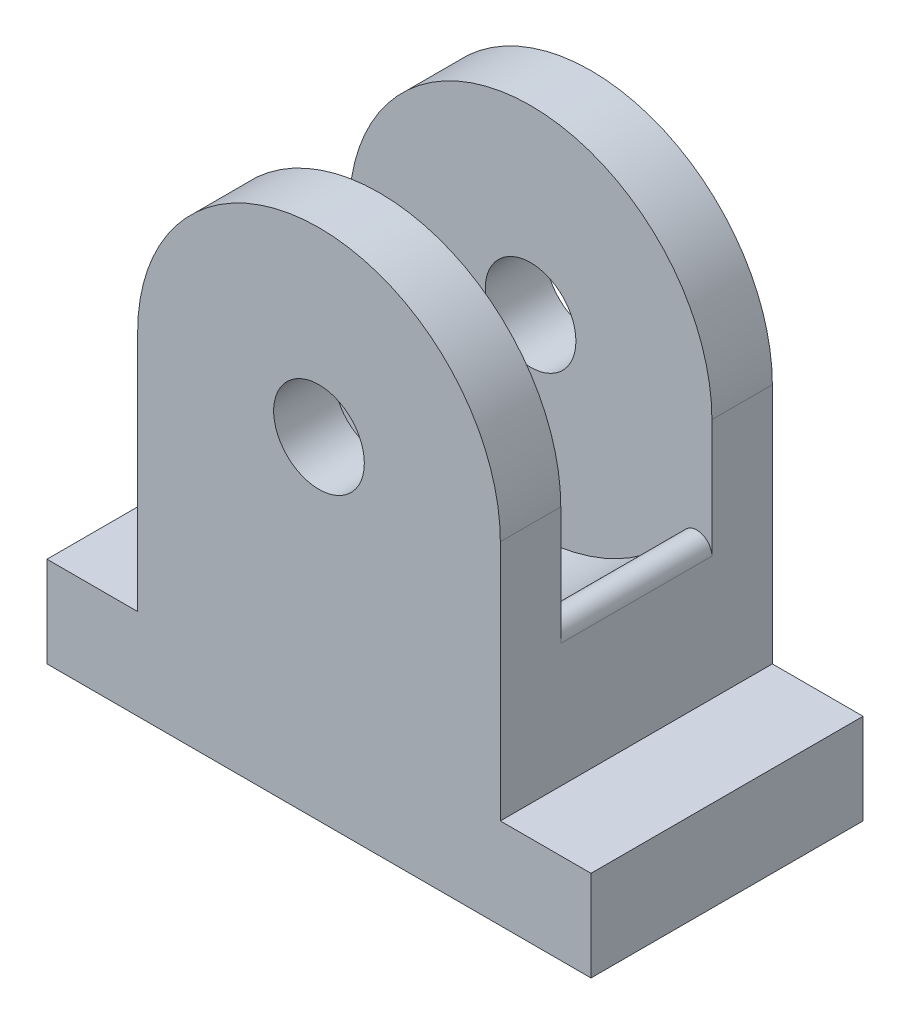
ISO-10303-21;
HEADER;
FILE_DESCRIPTION(('STEP AP214'),'2;1');
FILE_NAME('part.step','',(''),(''),'','','');
FILE_SCHEMA(('AUTOMOTIVE_DESIGN { 1 0 10303 214 1 1 1 1 }'));
ENDSEC;
DATA;
#1=APPLICATION_CONTEXT('core data for automotive mechanical design processes');
#2=APPLICATION_PROTOCOL_DEFINITION('international standard','automotive_design',2000,#1);
#3=PRODUCT_CONTEXT('',#1,'mechanical');
#4=PRODUCT('Part','Part','',(#3));
#5=PRODUCT_RELATED_PRODUCT_CATEGORY('part','',(#4));
#6=PRODUCT_DEFINITION_FORMATION('','',#4);
#7=PRODUCT_DEFINITION_CONTEXT('part definition',#1,'design');
#8=PRODUCT_DEFINITION('design','',#6,#7);
#9=PRODUCT_DEFINITION_SHAPE('','',#8);
#10=(LENGTH_UNIT() NAMED_UNIT(*) SI_UNIT(.MILLI.,.METRE.));
#11=(NAMED_UNIT(*) PLANE_ANGLE_UNIT() SI_UNIT($,.RADIAN.));
#12=(NAMED_UNIT(*) SI_UNIT($,.STERADIAN.) SOLID_ANGLE_UNIT());
#13=UNCERTAINTY_MEASURE_WITH_UNIT(LENGTH_MEASURE(1.E-05),#10,'distance_accuracy_value','');
#14=(GEOMETRIC_REPRESENTATION_CONTEXT(3) GLOBAL_UNCERTAINTY_ASSIGNED_CONTEXT((#13)) GLOBAL_UNIT_ASSIGNED_CONTEXT((#10,
#11,#12)) REPRESENTATION_CONTEXT('',''));
#15=CARTESIAN_POINT('',(0.,0.,0.));
#16=DIRECTION('',(0.,0.,1.));
#17=DIRECTION('',(1.,0.,0.));
#18=AXIS2_PLACEMENT_3D('',#15,#16,#17);
#19=CARTESIAN_POINT('',(0.,0.,4.5));
#20=DIRECTION('',(0.,0.,-1.));
#21=DIRECTION('',(-1.,0.,0.));
#22=AXIS2_PLACEMENT_3D('',#19,#20,#21);
#23=CYLINDRICAL_SURFACE('',#22,6.25);
#24=DIRECTION('',(0.,0.,-1.));
#25=VECTOR('',#24,1.);
#26=CARTESIAN_POINT('',(-5.09259259259259,-3.62325829687466,4.5));
#27=LINE('',#26,#25);
#28=CARTESIAN_POINT('',(-5.09259259259259,-3.62325829687466,2.));
#29=VERTEX_POINT('',#28);
#30=CARTESIAN_POINT('',(-5.09259259259259,-3.62325829687466,7.));
#31=VERTEX_POINT('',#30);
#32=EDGE_CURVE('E250',#29,#31,#27,.F.);
#33=ORIENTED_EDGE('',*,*,#32,.T.);
#34=CARTESIAN_POINT('',(0.,0.,7.));
#35=DIRECTION('',(0.,0.,-1.));
#36=DIRECTION('',(1.,0.,0.));
#37=AXIS2_PLACEMENT_3D('',#34,#35,#36);
#38=CIRCLE('',#37,6.25);
#39=CARTESIAN_POINT('',(5.09259259259259,-3.62325829687466,7.));
#40=VERTEX_POINT('',#39);
#41=EDGE_CURVE('E262',#40,#31,#38,.T.);
#42=ORIENTED_EDGE('',*,*,#41,.F.);
#43=DIRECTION('',(0.,0.,-1.));
#44=VECTOR('',#43,1.);
#45=CARTESIAN_POINT('',(5.09259259259259,-3.62325829687466,4.5));
#46=LINE('',#45,#44);
#47=CARTESIAN_POINT('',(5.09259259259259,-3.62325829687466,2.));
#48=VERTEX_POINT('',#47);
#49=EDGE_CURVE('E255',#40,#48,#46,.T.);
#50=ORIENTED_EDGE('',*,*,#49,.T.);
#51=CARTESIAN_POINT('',(0.,0.,2.));
#52=DIRECTION('',(0.,0.,-1.));
#53=DIRECTION('',(1.,0.,0.));
#54=AXIS2_PLACEMENT_3D('',#51,#52,#53);
#55=CIRCLE('',#54,6.25);
#56=EDGE_CURVE('E193',#48,#29,#55,.T.);
#57=ORIENTED_EDGE('',*,*,#56,.T.);
#58=EDGE_LOOP('',(#33,#42,#50,#57));
#59=FACE_BOUND('',#58,.T.);
#60=CARTESIAN_POINT('',(0.,-6.25,5.85));
#61=CARTESIAN_POINT('',(0.0748978096361095,-6.24999861581629,5.84999741034657));
#62=CARTESIAN_POINT('',(0.149827124191835,-6.24863997464167,5.84374597422724));
#63=CARTESIAN_POINT('',(0.297558976297404,-6.24335128756539,5.81893043998775));
#64=CARTESIAN_POINT('',(0.370359928320541,-6.23941937324927,5.80035739520087));
#65=CARTESIAN_POINT('',(0.511678529268872,-6.22942211904332,5.75150627019417));
#66=CARTESIAN_POINT('',(0.580200512385534,-6.2233589805583,5.72124026479619));
#67=CARTESIAN_POINT('',(0.711191114316262,-6.20975437315621,5.64990031863387));
#68=CARTESIAN_POINT('',(0.773659920097922,-6.20221294992144,5.60882671183515));
#69=CARTESIAN_POINT('',(0.891752597800647,-6.18634636801673,5.51635615783804));
#70=CARTESIAN_POINT('',(0.947268019970313,-6.17801169008855,5.46482233232173));
#71=CARTESIAN_POINT('',(1.04893788922345,-6.16156536796766,5.35318810995162));
#72=CARTESIAN_POINT('',(1.09509151799101,-6.15345374332559,5.29308696500821));
#73=CARTESIAN_POINT('',(1.17720361317461,-6.13827824078049,5.16522557734729));
#74=CARTESIAN_POINT('',(1.21304710226318,-6.13122656854735,5.09738991875832));
#75=CARTESIAN_POINT('',(1.27278407294276,-6.1191058096365,4.95648074161041));
#76=CARTESIAN_POINT('',(1.29667894540872,-6.1140364922184,4.88340783382453));
#77=CARTESIAN_POINT('',(1.33148293213386,-6.10655126462745,4.73527342952429));
#78=CARTESIAN_POINT('',(1.34258380128755,-6.10409621588904,4.66025900525517));
#79=CARTESIAN_POINT('',(1.35208081177302,-6.1019999104426,4.5093954183492));
#80=CARTESIAN_POINT('',(1.35047847470499,-6.10235831673662,4.4335463567727));
#81=CARTESIAN_POINT('',(1.33476897932179,-6.1058129733535,4.28458868169098));
#82=CARTESIAN_POINT('',(1.32088413245389,-6.10886054773759,4.21145532302482));
#83=CARTESIAN_POINT('',(1.28135577014403,-6.11727324424412,4.06858114357149));
#84=CARTESIAN_POINT('',(1.25571160968183,-6.12263849349441,3.99884050911371));
#85=CARTESIAN_POINT('',(1.1931872120857,-6.13513024879315,3.86410412628));
#86=CARTESIAN_POINT('',(1.15622109723758,-6.14227013471899,3.79914952152846));
#87=CARTESIAN_POINT('',(1.07216253831035,-6.157498414892,3.67628287641741));
#88=CARTESIAN_POINT('',(1.02506874631776,-6.16558693532969,3.61837177510006));
#89=CARTESIAN_POINT('',(0.920912816838289,-6.18201026812592,3.50995566349795));
#90=CARTESIAN_POINT('',(0.863661532942302,-6.19034667875595,3.45963243407206));
#91=CARTESIAN_POINT('',(0.741438443532449,-6.20617114145333,3.36927243546437));
#92=CARTESIAN_POINT('',(0.676466504836565,-6.21365917888181,3.3292358437657));
#93=CARTESIAN_POINT('',(0.540427554958071,-6.22696656271637,3.26054240984356));
#94=CARTESIAN_POINT('',(0.469348390747127,-6.23278247690027,3.23190892807234));
#95=CARTESIAN_POINT('',(0.323234121488422,-6.24206473515479,3.18704226149253));
#96=CARTESIAN_POINT('',(0.248199578746133,-6.24553141223256,3.17080731913489));
#97=CARTESIAN_POINT('',(0.097864197091749,-6.24967735063362,3.15146191694495));
#98=CARTESIAN_POINT('',(0.0225967331389312,-6.25040935706062,3.14810307499253));
#99=CARTESIAN_POINT('',(-0.127423818972377,-6.24915108649817,3.15393264018703));
#100=CARTESIAN_POINT('',(-0.202176940782123,-6.24716098933985,3.16312021847603));
#101=CARTESIAN_POINT('',(-0.348227141284269,-6.24071536589487,3.19357579630874));
#102=CARTESIAN_POINT('',(-0.419552571259704,-6.23628635326114,3.21471394499583));
#103=CARTESIAN_POINT('',(-0.557645616500002,-6.22545845649614,3.26832683760487));
#104=CARTESIAN_POINT('',(-0.624412849596855,-6.21905940744043,3.30080253069627));
#105=CARTESIAN_POINT('',(-0.752524380823113,-6.20487092055961,3.37668914064983));
#106=CARTESIAN_POINT('',(-0.813779863979238,-6.19706330348932,3.42024652067401));
#107=CARTESIAN_POINT('',(-0.928201254236524,-6.18096165151345,3.51686671943826));
#108=CARTESIAN_POINT('',(-0.981366136966816,-6.17266755519741,3.56993073998876));
#109=CARTESIAN_POINT('',(-1.0790756709002,-6.15634621464983,3.68519639249067));
#110=CARTESIAN_POINT('',(-1.12344854237619,-6.14832642832587,3.74754488998852));
#111=CARTESIAN_POINT('',(-1.20109400598567,-6.13363196375991,3.87895522252143));
#112=CARTESIAN_POINT('',(-1.23436707416059,-6.12695722783711,3.94801676948733));
#113=CARTESIAN_POINT('',(-1.28864661790835,-6.1157713027968,4.09052490794086));
#114=CARTESIAN_POINT('',(-1.30972139525587,-6.11124809258382,4.16394449424816));
#115=CARTESIAN_POINT('',(-1.33920738747857,-6.10485506361185,4.31339279939407));
#116=CARTESIAN_POINT('',(-1.34762056982402,-6.10298483261214,4.38942111098764));
#117=CARTESIAN_POINT('',(-1.35146243914018,-6.10213503405996,4.54019784514477));
#118=CARTESIAN_POINT('',(-1.34716334207217,-6.10309486339383,4.61493911920589));
#119=CARTESIAN_POINT('',(-1.32631007639841,-6.10766022776293,4.76260542219088));
#120=CARTESIAN_POINT('',(-1.30975604485933,-6.11126573320731,4.83553047141908));
#121=CARTESIAN_POINT('',(-1.26499285043262,-6.12068702031061,4.97728450065752));
#122=CARTESIAN_POINT('',(-1.23682236697838,-6.1264954617247,5.04612621497996));
#123=CARTESIAN_POINT('',(-1.16965950719278,-6.13967121716878,5.1781470345763));
#124=CARTESIAN_POINT('',(-1.13066603576335,-6.14703868892758,5.24132556597838));
#125=CARTESIAN_POINT('',(-1.04205714295264,-6.16268407562946,5.3615705981713));
#126=CARTESIAN_POINT('',(-0.992247325560747,-6.17097708593509,5.41849191108093));
#127=CARTESIAN_POINT('',(-0.883814758618736,-6.1874366898516,5.52325757239144));
#128=CARTESIAN_POINT('',(-0.825189977129407,-6.19560325383533,5.57109982220879));
#129=CARTESIAN_POINT('',(-0.699902983155826,-6.21101159381186,5.656924499032));
#130=CARTESIAN_POINT('',(-0.633148919741541,-6.21824044049574,5.69477528812321));
#131=CARTESIAN_POINT('',(-0.4940850138529,-6.2308295525729,5.75865978799255));
#132=CARTESIAN_POINT('',(-0.421779944901871,-6.23619140198087,5.78470352191314));
#133=CARTESIAN_POINT('',(-0.291157087569732,-6.24347278744987,5.81953195295137));
#134=CARTESIAN_POINT('',(-0.233551854911721,-6.24590545876608,5.8309358899752));
#135=CARTESIAN_POINT('',(-0.117304160996096,-6.24916957326932,5.84617076761794));
#136=CARTESIAN_POINT('',(-0.0586617436783265,-6.25000108412556,5.85000202827809));
#137=CARTESIAN_POINT('',(0.,-6.25,5.85));
#138=B_SPLINE_CURVE_WITH_KNOTS('',3,(#60,#61,#62,#63,#64,#65,#66,#67,#68,#69,#70,#71,#72,#73,
#74,#75,#76,#77,#78,#79,#80,#81,#82,#83,#84,#85,#86,#87,#88,#89,#90,#91,#92,#93,#94,#95,#96,#97,
#98,#99,#100,#101,#102,#103,#104,#105,#106,#107,#108,#109,#110,#111,#112,#113,#114,#115,#116,
#117,#118,#119,#120,#121,#122,#123,#124,#125,#126,#127,#128,#129,#130,#131,#132,#133,#134,#135,
#136,#137),.UNSPECIFIED.,.T.,.F.,(4,2,2,2,2,2,2,2,2,2,2,2,2,2,2,2,2,2,2,2,2,2,2,2,2,2,2,2,2,2,2,
2,2,2,2,2,2,2,4),(0.,0.224478722217928,0.449120616119271,0.673531149315529,0.897934748817567,
1.12548983415913,1.35306480156489,1.5830871295524,1.81308267562639,2.03958431476272,
2.26605882376131,2.48851618608015,2.71098575205936,2.93518640301403,3.15941691178404,
3.38837253084416,3.61733209998361,3.84675833301939,4.07615203780903,4.30109775663303,
4.5260286155195,4.7485611703904,4.97111235996431,5.19677339020995,5.42246296822622,
5.65220188881187,5.88193095523105,6.11036093790415,6.33875542144641,6.56229481267941,
6.78583170374923,7.00863021573458,7.23145127927605,7.45866870150071,7.6859385801831,
7.91606813022947,8.14600195319907,8.32182645181924,8.49764351947402),.UNSPECIFIED.);
#139=CARTESIAN_POINT('',(0.,-6.25,5.85));
#140=VERTEX_POINT('',#139);
#141=EDGE_CURVE('E37',#140,#140,#138,.T.);
#142=ORIENTED_EDGE('',*,*,#141,.F.);
#143=EDGE_LOOP('',(#142));
#144=FACE_BOUND('',#143,.T.);
#145=ADVANCED_FACE('F33',(#59,#144),#23,.F.);
#146=CARTESIAN_POINT('',(0.,0.,2.));
#147=DIRECTION('',(0.,0.,1.));
#148=DIRECTION('',(1.,0.,0.));
#149=AXIS2_PLACEMENT_3D('',#146,#147,#148);
#150=PLANE('',#149);
#151=CARTESIAN_POINT('',(0.,0.,2.));
#152=DIRECTION('',(0.,0.,1.));
#153=DIRECTION('',(1.,0.,0.));
#154=AXIS2_PLACEMENT_3D('',#151,#152,#153);
#155=CIRCLE('',#154,1.5);
#156=CARTESIAN_POINT('',(1.5,0.,2.));
#157=VERTEX_POINT('',#156);
#158=EDGE_CURVE('E196',#157,#157,#155,.T.);
#159=ORIENTED_EDGE('',*,*,#158,.F.);
#160=EDGE_LOOP('',(#159));
#161=FACE_BOUND('',#160,.T.);
#162=DIRECTION('',(0.,-1.,0.));
#163=VECTOR('',#162,1.);
#164=CARTESIAN_POINT('',(-6.,0.,2.));
#165=LINE('',#164,#163);
#166=CARTESIAN_POINT('',(-6.,0.,2.));
#167=VERTEX_POINT('',#166);
#168=CARTESIAN_POINT('',(-6.,-3.91311896062463,2.));
#169=VERTEX_POINT('',#168);
#170=EDGE_CURVE('E206',#167,#169,#165,.T.);
#171=ORIENTED_EDGE('',*,*,#170,.T.);
#172=CARTESIAN_POINT('',(-5.5,-3.91311896062463,2.));
#173=DIRECTION('',(0.,0.,1.));
#174=DIRECTION('',(1.,0.,0.));
#175=AXIS2_PLACEMENT_3D('',#172,#173,#174);
#176=CIRCLE('',#175,0.5);
#177=EDGE_CURVE('E252',#169,#29,#176,.F.);
#178=ORIENTED_EDGE('',*,*,#177,.T.);
#179=ORIENTED_EDGE('',*,*,#56,.F.);
#180=CARTESIAN_POINT('',(5.5,-3.91311896062463,2.));
#181=DIRECTION('',(0.,0.,1.));
#182=DIRECTION('',(1.,0.,0.));
#183=AXIS2_PLACEMENT_3D('',#180,#181,#182);
#184=CIRCLE('',#183,0.5);
#185=CARTESIAN_POINT('',(6.,-3.91311896062463,2.));
#186=VERTEX_POINT('',#185);
#187=EDGE_CURVE('E11',#48,#186,#184,.F.);
#188=ORIENTED_EDGE('',*,*,#187,.T.);
#189=DIRECTION('',(0.,1.,0.));
#190=VECTOR('',#189,1.);
#191=CARTESIAN_POINT('',(6.,0.,2.));
#192=LINE('',#191,#190);
#193=CARTESIAN_POINT('',(6.,0.,2.));
#194=VERTEX_POINT('',#193);
#195=EDGE_CURVE('E54',#186,#194,#192,.T.);
#196=ORIENTED_EDGE('',*,*,#195,.T.);
#197=CARTESIAN_POINT('',(0.,0.,2.));
#198=DIRECTION('',(0.,0.,1.));
#199=DIRECTION('',(1.,0.,0.));
#200=AXIS2_PLACEMENT_3D('',#197,#198,#199);
#201=CIRCLE('',#200,6.);
#202=EDGE_CURVE('E203',#194,#167,#201,.T.);
#203=ORIENTED_EDGE('',*,*,#202,.T.);
#204=EDGE_LOOP('',(#171,#178,#179,#188,#196,#203));
#205=FACE_BOUND('',#204,.T.);
#206=ADVANCED_FACE('F264',(#161,#205),#150,.T.);
#207=CARTESIAN_POINT('',(-6.,-8.,2.));
#208=DIRECTION('',(0.,-1.,0.));
#209=DIRECTION('',(0.,0.,-1.));
#210=AXIS2_PLACEMENT_3D('',#207,#208,#209);
#211=PLANE('',#210);
#212=DIRECTION('',(0.,0.,-1.));
#213=VECTOR('',#212,1.);
#214=CARTESIAN_POINT('',(-9.,-8.,2.));
#215=LINE('',#214,#213);
#216=CARTESIAN_POINT('',(-9.,-8.,9.));
#217=VERTEX_POINT('',#216);
#218=CARTESIAN_POINT('',(-9.,-8.,0.));
#219=VERTEX_POINT('',#218);
#220=EDGE_CURVE('E208',#217,#219,#215,.T.);
#221=ORIENTED_EDGE('',*,*,#220,.F.);
#222=DIRECTION('',(-1.,0.,0.));
#223=VECTOR('',#222,1.);
#224=CARTESIAN_POINT('',(-6.,-8.,9.));
#225=LINE('',#224,#223);
#226=CARTESIAN_POINT('',(-6.,-8.,9.));
#227=VERTEX_POINT('',#226);
#228=EDGE_CURVE('E157',#227,#217,#225,.T.);
#229=ORIENTED_EDGE('',*,*,#228,.F.);
#230=DIRECTION('',(0.,0.,-1.));
#231=VECTOR('',#230,1.);
#232=CARTESIAN_POINT('',(-6.,-8.,2.));
#233=LINE('',#232,#231);
#234=CARTESIAN_POINT('',(-6.,-8.,0.));
#235=VERTEX_POINT('',#234);
#236=EDGE_CURVE('E226',#227,#235,#233,.T.);
#237=ORIENTED_EDGE('',*,*,#236,.T.);
#238=DIRECTION('',(-1.,0.,0.));
#239=VECTOR('',#238,1.);
#240=CARTESIAN_POINT('',(-6.,-8.,0.));
#241=LINE('',#240,#239);
#242=EDGE_CURVE('E204',#235,#219,#241,.T.);
#243=ORIENTED_EDGE('',*,*,#242,.T.);
#244=EDGE_LOOP('',(#221,#229,#237,#243));
#245=FACE_BOUND('',#244,.T.);
#246=ADVANCED_FACE('F302',(#245),#211,.F.);
#247=DIRECTION('',(0.,0.,-1.));
#248=VECTOR('',#247,1.);
#249=CARTESIAN_POINT('',(6.,-8.,2.));
#250=LINE('',#249,#248);
#251=CARTESIAN_POINT('',(6.,-8.,9.));
#252=VERTEX_POINT('',#251);
#253=CARTESIAN_POINT('',(6.,-8.,0.));
#254=VERTEX_POINT('',#253);
#255=EDGE_CURVE('E235',#252,#254,#250,.T.);
#256=ORIENTED_EDGE('',*,*,#255,.F.);
#257=DIRECTION('',(-1.,0.,0.));
#258=VECTOR('',#257,1.);
#259=CARTESIAN_POINT('',(9.,-8.,9.));
#260=LINE('',#259,#258);
#261=CARTESIAN_POINT('',(9.,-8.,9.));
#262=VERTEX_POINT('',#261);
#263=EDGE_CURVE('E177',#262,#252,#260,.T.);
#264=ORIENTED_EDGE('',*,*,#263,.F.);
#265=DIRECTION('',(0.,0.,-1.));
#266=VECTOR('',#265,1.);
#267=CARTESIAN_POINT('',(9.,-8.,2.));
#268=LINE('',#267,#266);
#269=CARTESIAN_POINT('',(9.,-8.,0.));
#270=VERTEX_POINT('',#269);
#271=EDGE_CURVE('E238',#262,#270,#268,.T.);
#272=ORIENTED_EDGE('',*,*,#271,.T.);
#273=DIRECTION('',(-1.,0.,0.));
#274=VECTOR('',#273,1.);
#275=CARTESIAN_POINT('',(9.,-8.,0.));
#276=LINE('',#275,#274);
#277=EDGE_CURVE('E215',#270,#254,#276,.T.);
#278=ORIENTED_EDGE('',*,*,#277,.T.);
#279=EDGE_LOOP('',(#256,#264,#272,#278));
#280=FACE_BOUND('',#279,.T.);
#281=ADVANCED_FACE('F316',(#280),#211,.F.);
#282=CARTESIAN_POINT('',(0.,0.,0.));
#283=DIRECTION('',(0.,0.,1.));
#284=DIRECTION('',(1.,0.,0.));
#285=AXIS2_PLACEMENT_3D('',#282,#283,#284);
#286=PLANE('',#285);
#287=DIRECTION('',(0.,-1.,0.));
#288=VECTOR('',#287,1.);
#289=CARTESIAN_POINT('',(-9.,-8.,0.));
#290=LINE('',#289,#288);
#291=CARTESIAN_POINT('',(-9.,-11.,0.));
#292=VERTEX_POINT('',#291);
#293=EDGE_CURVE('E199',#219,#292,#290,.T.);
#294=ORIENTED_EDGE('',*,*,#293,.F.);
#295=ORIENTED_EDGE('',*,*,#242,.F.);
#296=DIRECTION('',(0.,-1.,0.));
#297=VECTOR('',#296,1.);
#298=CARTESIAN_POINT('',(-6.,0.,0.));
#299=LINE('',#298,#297);
#300=CARTESIAN_POINT('',(-6.,0.,0.));
#301=VERTEX_POINT('',#300);
#302=EDGE_CURVE('E221',#301,#235,#299,.T.);
#303=ORIENTED_EDGE('',*,*,#302,.F.);
#304=CARTESIAN_POINT('',(0.,0.,0.));
#305=DIRECTION('',(0.,0.,1.));
#306=DIRECTION('',(1.,0.,0.));
#307=AXIS2_PLACEMENT_3D('',#304,#305,#306);
#308=CIRCLE('',#307,6.);
#309=CARTESIAN_POINT('',(6.,0.,0.));
#310=VERTEX_POINT('',#309);
#311=EDGE_CURVE('E219',#310,#301,#308,.T.);
#312=ORIENTED_EDGE('',*,*,#311,.F.);
#313=DIRECTION('',(0.,1.,0.));
#314=VECTOR('',#313,1.);
#315=CARTESIAN_POINT('',(6.,0.,0.));
#316=LINE('',#315,#314);
#317=EDGE_CURVE('E217',#254,#310,#316,.T.);
#318=ORIENTED_EDGE('',*,*,#317,.F.);
#319=ORIENTED_EDGE('',*,*,#277,.F.);
#320=DIRECTION('',(0.,1.,0.));
#321=VECTOR('',#320,1.);
#322=CARTESIAN_POINT('',(9.,-11.,0.));
#323=LINE('',#322,#321);
#324=CARTESIAN_POINT('',(9.,-11.,0.));
#325=VERTEX_POINT('',#324);
#326=EDGE_CURVE('E213',#325,#270,#323,.T.);
#327=ORIENTED_EDGE('',*,*,#326,.F.);
#328=DIRECTION('',(1.,0.,0.));
#329=VECTOR('',#328,1.);
#330=CARTESIAN_POINT('',(-9.,-11.,0.));
#331=LINE('',#330,#329);
#332=EDGE_CURVE('E211',#292,#325,#331,.T.);
#333=ORIENTED_EDGE('',*,*,#332,.F.);
#334=EDGE_LOOP('',(#294,#295,#303,#312,#318,#319,#327,#333));
#335=FACE_BOUND('',#334,.T.);
#336=CARTESIAN_POINT('',(0.,0.,0.));
#337=DIRECTION('',(0.,0.,1.));
#338=DIRECTION('',(1.,0.,0.));
#339=AXIS2_PLACEMENT_3D('',#336,#337,#338);
#340=CIRCLE('',#339,1.5);
#341=CARTESIAN_POINT('',(1.5,0.,0.));
#342=VERTEX_POINT('',#341);
#343=EDGE_CURVE('E195',#342,#342,#340,.T.);
#344=ORIENTED_EDGE('',*,*,#343,.T.);
#345=EDGE_LOOP('',(#344));
#346=FACE_BOUND('',#345,.T.);
#347=ADVANCED_FACE('F312',(#335,#346),#286,.F.);
#348=CARTESIAN_POINT('',(-9.,-8.,2.));
#349=DIRECTION('',(1.,0.,0.));
#350=DIRECTION('',(0.,0.,-1.));
#351=AXIS2_PLACEMENT_3D('',#348,#349,#350);
#352=PLANE('',#351);
#353=ORIENTED_EDGE('',*,*,#293,.T.);
#354=DIRECTION('',(0.,0.,-1.));
#355=VECTOR('',#354,1.);
#356=CARTESIAN_POINT('',(-9.,-11.,2.));
#357=LINE('',#356,#355);
#358=CARTESIAN_POINT('',(-9.,-11.,9.));
#359=VERTEX_POINT('',#358);
#360=EDGE_CURVE('E244',#359,#292,#357,.T.);
#361=ORIENTED_EDGE('',*,*,#360,.F.);
#362=DIRECTION('',(0.,-1.,0.));
#363=VECTOR('',#362,1.);
#364=CARTESIAN_POINT('',(-9.,-8.,9.));
#365=LINE('',#364,#363);
#366=EDGE_CURVE('E167',#217,#359,#365,.T.);
#367=ORIENTED_EDGE('',*,*,#366,.F.);
#368=ORIENTED_EDGE('',*,*,#220,.T.);
#369=EDGE_LOOP('',(#353,#361,#367,#368));
#370=FACE_BOUND('',#369,.T.);
#371=ADVANCED_FACE('F315',(#370),#352,.F.);
#372=CARTESIAN_POINT('',(-9.,-11.,2.));
#373=DIRECTION('',(0.,1.,0.));
#374=DIRECTION('',(0.,0.,1.));
#375=AXIS2_PLACEMENT_3D('',#372,#373,#374);
#376=PLANE('',#375);
#377=CARTESIAN_POINT('',(0.,-11.,4.5));
#378=DIRECTION('',(0.,1.,0.));
#379=DIRECTION('',(0.,0.,1.));
#380=AXIS2_PLACEMENT_3D('',#377,#378,#379);
#381=CIRCLE('',#380,1.35);
#382=CARTESIAN_POINT('',(0.,-11.,5.85));
#383=VERTEX_POINT('',#382);
#384=EDGE_CURVE('E271',#383,#383,#381,.F.);
#385=ORIENTED_EDGE('',*,*,#384,.F.);
#386=EDGE_LOOP('',(#385));
#387=FACE_BOUND('',#386,.T.);
#388=ORIENTED_EDGE('',*,*,#332,.T.);
#389=DIRECTION('',(0.,0.,-1.));
#390=VECTOR('',#389,1.);
#391=CARTESIAN_POINT('',(9.,-11.,2.));
#392=LINE('',#391,#390);
#393=CARTESIAN_POINT('',(9.,-11.,9.));
#394=VERTEX_POINT('',#393);
#395=EDGE_CURVE('E241',#394,#325,#392,.T.);
#396=ORIENTED_EDGE('',*,*,#395,.F.);
#397=DIRECTION('',(1.,0.,0.));
#398=VECTOR('',#397,1.);
#399=CARTESIAN_POINT('',(-9.,-11.,9.));
#400=LINE('',#399,#398);
#401=EDGE_CURVE('E170',#359,#394,#400,.T.);
#402=ORIENTED_EDGE('',*,*,#401,.F.);
#403=ORIENTED_EDGE('',*,*,#360,.T.);
#404=EDGE_LOOP('',(#388,#396,#402,#403));
#405=FACE_BOUND('',#404,.T.);
#406=ADVANCED_FACE('F333',(#387,#405),#376,.F.);
#407=CARTESIAN_POINT('',(9.,-11.,2.));
#408=DIRECTION('',(-1.,0.,0.));
#409=DIRECTION('',(0.,0.,1.));
#410=AXIS2_PLACEMENT_3D('',#407,#408,#409);
#411=PLANE('',#410);
#412=ORIENTED_EDGE('',*,*,#326,.T.);
#413=ORIENTED_EDGE('',*,*,#271,.F.);
#414=DIRECTION('',(0.,1.,0.));
#415=VECTOR('',#414,1.);
#416=CARTESIAN_POINT('',(9.,-11.,9.));
#417=LINE('',#416,#415);
#418=EDGE_CURVE('E174',#394,#262,#417,.T.);
#419=ORIENTED_EDGE('',*,*,#418,.F.);
#420=ORIENTED_EDGE('',*,*,#395,.T.);
#421=EDGE_LOOP('',(#412,#413,#419,#420));
#422=FACE_BOUND('',#421,.T.);
#423=ADVANCED_FACE('F330',(#422),#411,.F.);
#424=CARTESIAN_POINT('',(6.,0.,2.));
#425=DIRECTION('',(-1.,0.,0.));
#426=DIRECTION('',(0.,0.,1.));
#427=AXIS2_PLACEMENT_3D('',#424,#425,#426);
#428=PLANE('',#427);
#429=ORIENTED_EDGE('',*,*,#195,.F.);
#430=DIRECTION('',(0.,0.,-1.));
#431=VECTOR('',#430,1.);
#432=CARTESIAN_POINT('',(6.,-3.91311896062463,2.));
#433=LINE('',#432,#431);
#434=CARTESIAN_POINT('',(6.,-3.91311896062463,7.));
#435=VERTEX_POINT('',#434);
#436=EDGE_CURVE('E47',#186,#435,#433,.F.);
#437=ORIENTED_EDGE('',*,*,#436,.T.);
#438=DIRECTION('',(0.,1.,0.));
#439=VECTOR('',#438,1.);
#440=CARTESIAN_POINT('',(6.,0.,7.));
#441=LINE('',#440,#439);
#442=CARTESIAN_POINT('',(6.,0.,7.));
#443=VERTEX_POINT('',#442);
#444=EDGE_CURVE('E152',#435,#443,#441,.T.);
#445=ORIENTED_EDGE('',*,*,#444,.T.);
#446=DIRECTION('',(0.,0.,1.));
#447=VECTOR('',#446,1.);
#448=CARTESIAN_POINT('',(6.,0.,7.));
#449=LINE('',#448,#447);
#450=CARTESIAN_POINT('',(6.,0.,9.));
#451=VERTEX_POINT('',#450);
#452=EDGE_CURVE('E138',#443,#451,#449,.T.);
#453=ORIENTED_EDGE('',*,*,#452,.T.);
#454=DIRECTION('',(0.,1.,0.));
#455=VECTOR('',#454,1.);
#456=CARTESIAN_POINT('',(6.,0.,9.));
#457=LINE('',#456,#455);
#458=EDGE_CURVE('E180',#252,#451,#457,.T.);
#459=ORIENTED_EDGE('',*,*,#458,.F.);
#460=ORIENTED_EDGE('',*,*,#255,.T.);
#461=ORIENTED_EDGE('',*,*,#317,.T.);
#462=DIRECTION('',(0.,0.,-1.));
#463=VECTOR('',#462,1.);
#464=CARTESIAN_POINT('',(6.,0.,2.));
#465=LINE('',#464,#463);
#466=EDGE_CURVE('E232',#194,#310,#465,.T.);
#467=ORIENTED_EDGE('',*,*,#466,.F.);
#468=EDGE_LOOP('',(#429,#437,#445,#453,#459,#460,#461,#467));
#469=FACE_BOUND('',#468,.T.);
#470=ADVANCED_FACE('F153',(#469),#428,.F.);
#471=CARTESIAN_POINT('',(0.,0.,2.));
#472=DIRECTION('',(0.,0.,-1.));
#473=DIRECTION('',(-1.,0.,0.));
#474=AXIS2_PLACEMENT_3D('',#471,#472,#473);
#475=CYLINDRICAL_SURFACE('',#474,6.);
#476=ORIENTED_EDGE('',*,*,#311,.T.);
#477=DIRECTION('',(0.,0.,-1.));
#478=VECTOR('',#477,1.);
#479=CARTESIAN_POINT('',(-6.,0.,2.));
#480=LINE('',#479,#478);
#481=EDGE_CURVE('E229',#167,#301,#480,.T.);
#482=ORIENTED_EDGE('',*,*,#481,.F.);
#483=ORIENTED_EDGE('',*,*,#202,.F.);
#484=ORIENTED_EDGE('',*,*,#466,.T.);
#485=EDGE_LOOP('',(#476,#482,#483,#484));
#486=FACE_BOUND('',#485,.T.);
#487=ADVANCED_FACE('F323',(#486),#475,.T.);
#488=CARTESIAN_POINT('',(-6.,0.,2.));
#489=DIRECTION('',(1.,0.,0.));
#490=DIRECTION('',(0.,1.,0.));
#491=AXIS2_PLACEMENT_3D('',#488,#489,#490);
#492=PLANE('',#491);
#493=ORIENTED_EDGE('',*,*,#236,.F.);
#494=DIRECTION('',(0.,-1.,0.));
#495=VECTOR('',#494,1.);
#496=CARTESIAN_POINT('',(-6.,0.,9.));
#497=LINE('',#496,#495);
#498=CARTESIAN_POINT('',(-6.,0.,9.));
#499=VERTEX_POINT('',#498);
#500=EDGE_CURVE('E183',#499,#227,#497,.T.);
#501=ORIENTED_EDGE('',*,*,#500,.F.);
#502=DIRECTION('',(0.,0.,1.));
#503=VECTOR('',#502,1.);
#504=CARTESIAN_POINT('',(-6.,0.,7.));
#505=LINE('',#504,#503);
#506=CARTESIAN_POINT('',(-6.,0.,7.));
#507=VERTEX_POINT('',#506);
#508=EDGE_CURVE('E149',#507,#499,#505,.T.);
#509=ORIENTED_EDGE('',*,*,#508,.F.);
#510=DIRECTION('',(0.,-1.,0.));
#511=VECTOR('',#510,1.);
#512=CARTESIAN_POINT('',(-6.,0.,7.));
#513=LINE('',#512,#511);
#514=CARTESIAN_POINT('',(-6.,-3.91311896062463,7.));
#515=VERTEX_POINT('',#514);
#516=EDGE_CURVE('E162',#507,#515,#513,.T.);
#517=ORIENTED_EDGE('',*,*,#516,.T.);
#518=DIRECTION('',(0.,0.,-1.));
#519=VECTOR('',#518,1.);
#520=CARTESIAN_POINT('',(-6.,-3.91311896062463,2.));
#521=LINE('',#520,#519);
#522=EDGE_CURVE('E247',#515,#169,#521,.T.);
#523=ORIENTED_EDGE('',*,*,#522,.T.);
#524=ORIENTED_EDGE('',*,*,#170,.F.);
#525=ORIENTED_EDGE('',*,*,#481,.T.);
#526=ORIENTED_EDGE('',*,*,#302,.T.);
#527=EDGE_LOOP('',(#493,#501,#509,#517,#523,#524,#525,#526));
#528=FACE_BOUND('',#527,.T.);
#529=ADVANCED_FACE('F309',(#528),#492,.F.);
#530=CARTESIAN_POINT('',(0.,0.,2.));
#531=DIRECTION('',(0.,0.,-1.));
#532=DIRECTION('',(-1.,0.,0.));
#533=AXIS2_PLACEMENT_3D('',#530,#531,#532);
#534=CYLINDRICAL_SURFACE('',#533,1.5);
#535=ORIENTED_EDGE('',*,*,#158,.T.);
#536=EDGE_LOOP('',(#535));
#537=FACE_BOUND('',#536,.T.);
#538=ORIENTED_EDGE('',*,*,#343,.F.);
#539=EDGE_LOOP('',(#538));
#540=FACE_BOUND('',#539,.T.);
#541=ADVANCED_FACE('F307',(#537,#540),#534,.F.);
#542=CARTESIAN_POINT('',(-5.5,-3.91311896062463,4.5));
#543=DIRECTION('',(0.,0.,-1.));
#544=DIRECTION('',(-1.,0.,0.));
#545=AXIS2_PLACEMENT_3D('',#542,#543,#544);
#546=CYLINDRICAL_SURFACE('',#545,0.5);
#547=ORIENTED_EDGE('',*,*,#522,.F.);
#548=CARTESIAN_POINT('',(-5.5,-3.91311896062463,7.));
#549=DIRECTION('',(0.,0.,1.));
#550=DIRECTION('',(1.,0.,0.));
#551=AXIS2_PLACEMENT_3D('',#548,#549,#550);
#552=CIRCLE('',#551,0.5);
#553=EDGE_CURVE('E148',#515,#31,#552,.F.);
#554=ORIENTED_EDGE('',*,*,#553,.T.);
#555=ORIENTED_EDGE('',*,*,#32,.F.);
#556=ORIENTED_EDGE('',*,*,#177,.F.);
#557=EDGE_LOOP('',(#547,#554,#555,#556));
#558=FACE_BOUND('',#557,.T.);
#559=ADVANCED_FACE('F269',(#558),#546,.T.);
#560=CARTESIAN_POINT('',(5.5,-3.91311896062463,4.5));
#561=DIRECTION('',(0.,0.,-1.));
#562=DIRECTION('',(-1.,0.,0.));
#563=AXIS2_PLACEMENT_3D('',#560,#561,#562);
#564=CYLINDRICAL_SURFACE('',#563,0.5);
#565=ORIENTED_EDGE('',*,*,#49,.F.);
#566=CARTESIAN_POINT('',(5.5,-3.91311896062463,7.));
#567=DIRECTION('',(0.,0.,1.));
#568=DIRECTION('',(1.,0.,0.));
#569=AXIS2_PLACEMENT_3D('',#566,#567,#568);
#570=CIRCLE('',#569,0.5);
#571=EDGE_CURVE('E191',#40,#435,#570,.F.);
#572=ORIENTED_EDGE('',*,*,#571,.T.);
#573=ORIENTED_EDGE('',*,*,#436,.F.);
#574=ORIENTED_EDGE('',*,*,#187,.F.);
#575=EDGE_LOOP('',(#565,#572,#573,#574));
#576=FACE_BOUND('',#575,.T.);
#577=ADVANCED_FACE('F35',(#576),#564,.T.);
#578=CARTESIAN_POINT('',(0.,0.,7.));
#579=DIRECTION('',(0.,0.,-1.));
#580=DIRECTION('',(1.,0.,0.));
#581=AXIS2_PLACEMENT_3D('',#578,#579,#580);
#582=PLANE('',#581);
#583=CARTESIAN_POINT('',(0.,0.,7.));
#584=DIRECTION('',(0.,0.,1.));
#585=DIRECTION('',(1.,0.,0.));
#586=AXIS2_PLACEMENT_3D('',#583,#584,#585);
#587=CIRCLE('',#586,1.5);
#588=CARTESIAN_POINT('',(1.5,0.,7.));
#589=VERTEX_POINT('',#588);
#590=EDGE_CURVE('E171',#589,#589,#587,.T.);
#591=ORIENTED_EDGE('',*,*,#590,.T.);
#592=EDGE_LOOP('',(#591));
#593=FACE_BOUND('',#592,.T.);
#594=ORIENTED_EDGE('',*,*,#516,.F.);
#595=CARTESIAN_POINT('',(0.,0.,7.));
#596=DIRECTION('',(0.,0.,1.));
#597=DIRECTION('',(1.,0.,0.));
#598=AXIS2_PLACEMENT_3D('',#595,#596,#597);
#599=CIRCLE('',#598,6.);
#600=EDGE_CURVE('E142',#443,#507,#599,.T.);
#601=ORIENTED_EDGE('',*,*,#600,.F.);
#602=ORIENTED_EDGE('',*,*,#444,.F.);
#603=ORIENTED_EDGE('',*,*,#571,.F.);
#604=ORIENTED_EDGE('',*,*,#41,.T.);
#605=ORIENTED_EDGE('',*,*,#553,.F.);
#606=EDGE_LOOP('',(#594,#601,#602,#603,#604,#605));
#607=FACE_BOUND('',#606,.T.);
#608=ADVANCED_FACE('F159',(#593,#607),#582,.T.);
#609=CARTESIAN_POINT('',(0.,0.,9.));
#610=DIRECTION('',(0.,0.,-1.));
#611=DIRECTION('',(1.,0.,0.));
#612=AXIS2_PLACEMENT_3D('',#609,#610,#611);
#613=PLANE('',#612);
#614=ORIENTED_EDGE('',*,*,#366,.T.);
#615=ORIENTED_EDGE('',*,*,#401,.T.);
#616=ORIENTED_EDGE('',*,*,#418,.T.);
#617=ORIENTED_EDGE('',*,*,#263,.T.);
#618=ORIENTED_EDGE('',*,*,#458,.T.);
#619=CARTESIAN_POINT('',(0.,0.,9.));
#620=DIRECTION('',(0.,0.,1.));
#621=DIRECTION('',(1.,0.,0.));
#622=AXIS2_PLACEMENT_3D('',#619,#620,#621);
#623=CIRCLE('',#622,6.);
#624=EDGE_CURVE('E145',#451,#499,#623,.T.);
#625=ORIENTED_EDGE('',*,*,#624,.T.);
#626=ORIENTED_EDGE('',*,*,#500,.T.);
#627=ORIENTED_EDGE('',*,*,#228,.T.);
#628=EDGE_LOOP('',(#614,#615,#616,#617,#618,#625,#626,#627));
#629=FACE_BOUND('',#628,.T.);
#630=CARTESIAN_POINT('',(0.,0.,9.));
#631=DIRECTION('',(0.,0.,1.));
#632=DIRECTION('',(1.,0.,0.));
#633=AXIS2_PLACEMENT_3D('',#630,#631,#632);
#634=CIRCLE('',#633,1.5);
#635=CARTESIAN_POINT('',(1.5,0.,9.));
#636=VERTEX_POINT('',#635);
#637=EDGE_CURVE('E270',#636,#636,#634,.T.);
#638=ORIENTED_EDGE('',*,*,#637,.F.);
#639=EDGE_LOOP('',(#638));
#640=FACE_BOUND('',#639,.T.);
#641=ADVANCED_FACE('F288',(#629,#640),#613,.F.);
#642=CARTESIAN_POINT('',(0.,0.,7.));
#643=DIRECTION('',(0.,0.,1.));
#644=DIRECTION('',(-1.,0.,0.));
#645=AXIS2_PLACEMENT_3D('',#642,#643,#644);
#646=CYLINDRICAL_SURFACE('',#645,6.);
#647=ORIENTED_EDGE('',*,*,#624,.F.);
#648=ORIENTED_EDGE('',*,*,#452,.F.);
#649=ORIENTED_EDGE('',*,*,#600,.T.);
#650=ORIENTED_EDGE('',*,*,#508,.T.);
#651=EDGE_LOOP('',(#647,#648,#649,#650));
#652=FACE_BOUND('',#651,.T.);
#653=ADVANCED_FACE('F140',(#652),#646,.T.);
#654=CARTESIAN_POINT('',(0.,0.,7.));
#655=DIRECTION('',(0.,0.,1.));
#656=DIRECTION('',(-1.,0.,0.));
#657=AXIS2_PLACEMENT_3D('',#654,#655,#656);
#658=CYLINDRICAL_SURFACE('',#657,1.5);
#659=ORIENTED_EDGE('',*,*,#590,.F.);
#660=EDGE_LOOP('',(#659));
#661=FACE_BOUND('',#660,.T.);
#662=ORIENTED_EDGE('',*,*,#637,.T.);
#663=EDGE_LOOP('',(#662));
#664=FACE_BOUND('',#663,.T.);
#665=ADVANCED_FACE('F281',(#661,#664),#658,.F.);
#666=CARTESIAN_POINT('',(0.,-11.000012,4.5));
#667=DIRECTION('',(0.,1.,0.));
#668=DIRECTION('',(0.,0.,1.));
#669=AXIS2_PLACEMENT_3D('',#666,#667,#668);
#670=CYLINDRICAL_SURFACE('',#669,1.35);
#671=ORIENTED_EDGE('',*,*,#141,.T.);
#672=EDGE_LOOP('',(#671));
#673=FACE_BOUND('',#672,.T.);
#674=ORIENTED_EDGE('',*,*,#384,.T.);
#675=EDGE_LOOP('',(#674));
#676=FACE_BOUND('',#675,.T.);
#677=ADVANCED_FACE('F284',(#673,#676),#670,.F.);
#678=CLOSED_SHELL('',(#145,#206,#246,#281,#347,#371,#406,#423,#470,#487,#529,#541,#559,#577,
#608,#641,#653,#665,#677));
#679=MANIFOLD_SOLID_BREP('B2',#678);
#680=ADVANCED_BREP_SHAPE_REPRESENTATION('',(#18,#679),#14);
#681=SHAPE_DEFINITION_REPRESENTATION(#9,#680);
ENDSEC;
END-ISO-10303-21;
